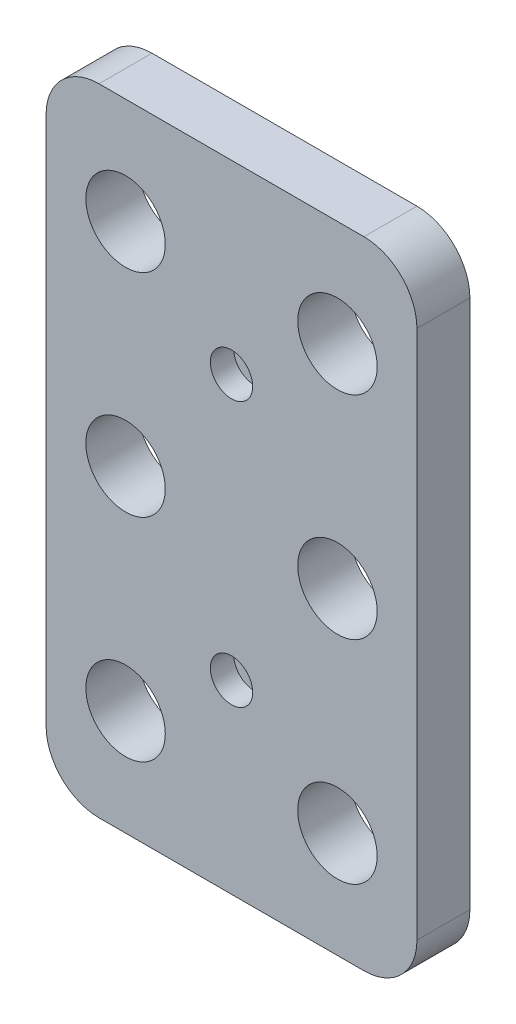
ISO-10303-21;
HEADER;
FILE_DESCRIPTION(('STEP AP214'),'2;1');
FILE_NAME('part.step','',(''),(''),'','','');
FILE_SCHEMA(('AUTOMOTIVE_DESIGN { 1 0 10303 214 1 1 1 1 }'));
ENDSEC;
DATA;
#1=APPLICATION_CONTEXT('core data for automotive mechanical design processes');
#2=APPLICATION_PROTOCOL_DEFINITION('international standard','automotive_design',2000,#1);
#3=PRODUCT_CONTEXT('',#1,'mechanical');
#4=PRODUCT('Part','Part','',(#3));
#5=PRODUCT_RELATED_PRODUCT_CATEGORY('part','',(#4));
#6=PRODUCT_DEFINITION_FORMATION('','',#4);
#7=PRODUCT_DEFINITION_CONTEXT('part definition',#1,'design');
#8=PRODUCT_DEFINITION('design','',#6,#7);
#9=PRODUCT_DEFINITION_SHAPE('','',#8);
#10=(LENGTH_UNIT() NAMED_UNIT(*) SI_UNIT(.MILLI.,.METRE.));
#11=(NAMED_UNIT(*) PLANE_ANGLE_UNIT() SI_UNIT($,.RADIAN.));
#12=(NAMED_UNIT(*) SI_UNIT($,.STERADIAN.) SOLID_ANGLE_UNIT());
#13=UNCERTAINTY_MEASURE_WITH_UNIT(LENGTH_MEASURE(1.E-05),#10,'distance_accuracy_value','');
#14=(GEOMETRIC_REPRESENTATION_CONTEXT(3) GLOBAL_UNCERTAINTY_ASSIGNED_CONTEXT((#13)) GLOBAL_UNIT_ASSIGNED_CONTEXT((#10,
#11,#12)) REPRESENTATION_CONTEXT('',''));
#15=CARTESIAN_POINT('',(0.,0.,0.));
#16=DIRECTION('',(0.,0.,1.));
#17=DIRECTION('',(1.,0.,0.));
#18=AXIS2_PLACEMENT_3D('',#15,#16,#17);
#19=CARTESIAN_POINT('',(0.,25.,10.));
#20=DIRECTION('',(0.,0.,-1.));
#21=DIRECTION('',(-1.,0.,0.));
#22=AXIS2_PLACEMENT_3D('',#19,#20,#21);
#23=CYLINDRICAL_SURFACE('',#22,2.25);
#24=CARTESIAN_POINT('',(0.,25.,0.));
#25=DIRECTION('',(0.,0.,1.));
#26=DIRECTION('',(1.,0.,0.));
#27=AXIS2_PLACEMENT_3D('',#24,#25,#26);
#28=CIRCLE('',#27,2.25);
#29=CARTESIAN_POINT('',(2.25,25.,0.));
#30=VERTEX_POINT('',#29);
#31=EDGE_CURVE('E214',#30,#30,#28,.T.);
#32=ORIENTED_EDGE('',*,*,#31,.F.);
#33=EDGE_LOOP('',(#32));
#34=FACE_BOUND('',#33,.T.);
#35=CARTESIAN_POINT('',(0.,25.,5.6));
#36=DIRECTION('',(0.,0.,1.));
#37=DIRECTION('',(1.,0.,0.));
#38=AXIS2_PLACEMENT_3D('',#35,#36,#37);
#39=CIRCLE('',#38,2.25);
#40=CARTESIAN_POINT('',(2.25,25.,5.6));
#41=VERTEX_POINT('',#40);
#42=EDGE_CURVE('E43',#41,#41,#39,.T.);
#43=ORIENTED_EDGE('',*,*,#42,.T.);
#44=EDGE_LOOP('',(#43));
#45=FACE_BOUND('',#44,.T.);
#46=ADVANCED_FACE('F39',(#34,#45),#23,.F.);
#47=CARTESIAN_POINT('',(0.,-25.,10.));
#48=DIRECTION('',(0.,0.,-1.));
#49=DIRECTION('',(-1.,0.,0.));
#50=AXIS2_PLACEMENT_3D('',#47,#48,#49);
#51=CYLINDRICAL_SURFACE('',#50,2.25);
#52=CARTESIAN_POINT('',(0.,-25.,0.));
#53=DIRECTION('',(0.,0.,1.));
#54=DIRECTION('',(-1.,0.,0.));
#55=AXIS2_PLACEMENT_3D('',#52,#53,#54);
#56=CIRCLE('',#55,2.25);
#57=CARTESIAN_POINT('',(-2.24999999999999,-25.,0.));
#58=VERTEX_POINT('',#57);
#59=EDGE_CURVE('E193',#58,#58,#56,.T.);
#60=ORIENTED_EDGE('',*,*,#59,.F.);
#61=EDGE_LOOP('',(#60));
#62=FACE_BOUND('',#61,.T.);
#63=CARTESIAN_POINT('',(0.,-25.,5.6));
#64=DIRECTION('',(0.,0.,1.));
#65=DIRECTION('',(1.,0.,0.));
#66=AXIS2_PLACEMENT_3D('',#63,#64,#65);
#67=CIRCLE('',#66,2.25);
#68=CARTESIAN_POINT('',(2.25,-25.,5.6));
#69=VERTEX_POINT('',#68);
#70=EDGE_CURVE('E184',#69,#69,#67,.T.);
#71=ORIENTED_EDGE('',*,*,#70,.T.);
#72=EDGE_LOOP('',(#71));
#73=FACE_BOUND('',#72,.T.);
#74=ADVANCED_FACE('F307',(#62,#73),#51,.F.);
#75=CARTESIAN_POINT('',(-25.,-50.,10.));
#76=DIRECTION('',(0.,0.,-1.));
#77=DIRECTION('',(-1.,0.,0.));
#78=AXIS2_PLACEMENT_3D('',#75,#76,#77);
#79=PLANE('',#78);
#80=CARTESIAN_POINT('',(0.,25.,10.));
#81=DIRECTION('',(0.,0.,1.));
#82=DIRECTION('',(1.,0.,0.));
#83=AXIS2_PLACEMENT_3D('',#80,#81,#82);
#84=CIRCLE('',#83,4.);
#85=CARTESIAN_POINT('',(4.,25.,10.));
#86=VERTEX_POINT('',#85);
#87=EDGE_CURVE('E195',#86,#86,#84,.T.);
#88=ORIENTED_EDGE('',*,*,#87,.F.);
#89=EDGE_LOOP('',(#88));
#90=FACE_BOUND('',#89,.T.);
#91=CARTESIAN_POINT('',(0.,-25.,10.));
#92=DIRECTION('',(0.,0.,1.));
#93=DIRECTION('',(1.,0.,0.));
#94=AXIS2_PLACEMENT_3D('',#91,#92,#93);
#95=CIRCLE('',#94,4.);
#96=CARTESIAN_POINT('',(4.,-25.,10.));
#97=VERTEX_POINT('',#96);
#98=EDGE_CURVE('E207',#97,#97,#95,.T.);
#99=ORIENTED_EDGE('',*,*,#98,.F.);
#100=EDGE_LOOP('',(#99));
#101=FACE_BOUND('',#100,.T.);
#102=CARTESIAN_POINT('',(-25.,-50.,10.));
#103=DIRECTION('',(0.,0.,1.));
#104=DIRECTION('',(-1.,0.,0.));
#105=AXIS2_PLACEMENT_3D('',#102,#103,#104);
#106=CIRCLE('',#105,10.);
#107=CARTESIAN_POINT('',(-35.,-49.9999999999999,10.));
#108=VERTEX_POINT('',#107);
#109=CARTESIAN_POINT('',(-24.9999999999999,-60.,10.));
#110=VERTEX_POINT('',#109);
#111=EDGE_CURVE('E167',#108,#110,#106,.T.);
#112=ORIENTED_EDGE('',*,*,#111,.T.);
#113=DIRECTION('',(1.,0.,0.));
#114=VECTOR('',#113,1.);
#115=CARTESIAN_POINT('',(-24.9999999999999,-60.,10.));
#116=LINE('',#115,#114);
#117=CARTESIAN_POINT('',(24.9999999999999,-60.,10.));
#118=VERTEX_POINT('',#117);
#119=EDGE_CURVE('E102',#110,#118,#116,.T.);
#120=ORIENTED_EDGE('',*,*,#119,.T.);
#121=CARTESIAN_POINT('',(25.,-50.,10.));
#122=DIRECTION('',(0.,0.,1.));
#123=DIRECTION('',(1.,0.,0.));
#124=AXIS2_PLACEMENT_3D('',#121,#122,#123);
#125=CIRCLE('',#124,10.);
#126=CARTESIAN_POINT('',(35.,-50.,10.));
#127=VERTEX_POINT('',#126);
#128=EDGE_CURVE('E269',#118,#127,#125,.T.);
#129=ORIENTED_EDGE('',*,*,#128,.T.);
#130=DIRECTION('',(0.,1.,0.));
#131=VECTOR('',#130,1.);
#132=CARTESIAN_POINT('',(35.,-49.9999999999999,10.));
#133=LINE('',#132,#131);
#134=CARTESIAN_POINT('',(35.,49.9999999999999,10.));
#135=VERTEX_POINT('',#134);
#136=EDGE_CURVE('E272',#127,#135,#133,.T.);
#137=ORIENTED_EDGE('',*,*,#136,.T.);
#138=CARTESIAN_POINT('',(25.,50.,10.));
#139=DIRECTION('',(0.,0.,1.));
#140=DIRECTION('',(-1.,0.,0.));
#141=AXIS2_PLACEMENT_3D('',#138,#139,#140);
#142=CIRCLE('',#141,10.);
#143=CARTESIAN_POINT('',(24.9999999999999,60.,10.));
#144=VERTEX_POINT('',#143);
#145=EDGE_CURVE('E122',#135,#144,#142,.T.);
#146=ORIENTED_EDGE('',*,*,#145,.T.);
#147=DIRECTION('',(-1.,0.,0.));
#148=VECTOR('',#147,1.);
#149=CARTESIAN_POINT('',(-24.9999999999999,60.,10.));
#150=LINE('',#149,#148);
#151=CARTESIAN_POINT('',(-24.9999999999999,60.,10.));
#152=VERTEX_POINT('',#151);
#153=EDGE_CURVE('E115',#144,#152,#150,.T.);
#154=ORIENTED_EDGE('',*,*,#153,.T.);
#155=CARTESIAN_POINT('',(-25.,50.,10.));
#156=DIRECTION('',(0.,0.,1.));
#157=DIRECTION('',(-1.,0.,0.));
#158=AXIS2_PLACEMENT_3D('',#155,#156,#157);
#159=CIRCLE('',#158,10.);
#160=CARTESIAN_POINT('',(-35.,49.9999999999999,10.));
#161=VERTEX_POINT('',#160);
#162=EDGE_CURVE('E120',#152,#161,#159,.T.);
#163=ORIENTED_EDGE('',*,*,#162,.T.);
#164=DIRECTION('',(0.,-1.,0.));
#165=VECTOR('',#164,1.);
#166=CARTESIAN_POINT('',(-35.,-49.9999999999999,10.));
#167=LINE('',#166,#165);
#168=EDGE_CURVE('E59',#161,#108,#167,.T.);
#169=ORIENTED_EDGE('',*,*,#168,.T.);
#170=EDGE_LOOP('',(#112,#120,#129,#137,#146,#154,#163,#169));
#171=FACE_BOUND('',#170,.T.);
#172=CARTESIAN_POINT('',(20.,40.,10.));
#173=DIRECTION('',(0.,0.,1.));
#174=DIRECTION('',(1.,0.,0.));
#175=AXIS2_PLACEMENT_3D('',#172,#173,#174);
#176=CIRCLE('',#175,7.5);
#177=CARTESIAN_POINT('',(27.5,40.,10.));
#178=VERTEX_POINT('',#177);
#179=EDGE_CURVE('E149',#178,#178,#176,.T.);
#180=ORIENTED_EDGE('',*,*,#179,.F.);
#181=EDGE_LOOP('',(#180));
#182=FACE_BOUND('',#181,.T.);
#183=CARTESIAN_POINT('',(20.,0.,10.));
#184=DIRECTION('',(0.,0.,1.));
#185=DIRECTION('',(1.,0.,0.));
#186=AXIS2_PLACEMENT_3D('',#183,#184,#185);
#187=CIRCLE('',#186,7.5);
#188=CARTESIAN_POINT('',(27.5,0.,10.));
#189=VERTEX_POINT('',#188);
#190=EDGE_CURVE('E251',#189,#189,#187,.T.);
#191=ORIENTED_EDGE('',*,*,#190,.F.);
#192=EDGE_LOOP('',(#191));
#193=FACE_BOUND('',#192,.T.);
#194=CARTESIAN_POINT('',(20.,-40.,10.));
#195=DIRECTION('',(0.,0.,1.));
#196=DIRECTION('',(-1.,0.,0.));
#197=AXIS2_PLACEMENT_3D('',#194,#195,#196);
#198=CIRCLE('',#197,7.5);
#199=CARTESIAN_POINT('',(12.5,-40.,10.));
#200=VERTEX_POINT('',#199);
#201=EDGE_CURVE('E243',#200,#200,#198,.T.);
#202=ORIENTED_EDGE('',*,*,#201,.F.);
#203=EDGE_LOOP('',(#202));
#204=FACE_BOUND('',#203,.T.);
#205=CARTESIAN_POINT('',(-20.,-40.,10.));
#206=DIRECTION('',(0.,0.,1.));
#207=DIRECTION('',(1.,0.,0.));
#208=AXIS2_PLACEMENT_3D('',#205,#206,#207);
#209=CIRCLE('',#208,7.5);
#210=CARTESIAN_POINT('',(-12.5,-40.,10.));
#211=VERTEX_POINT('',#210);
#212=EDGE_CURVE('E235',#211,#211,#209,.T.);
#213=ORIENTED_EDGE('',*,*,#212,.F.);
#214=EDGE_LOOP('',(#213));
#215=FACE_BOUND('',#214,.T.);
#216=CARTESIAN_POINT('',(-20.,0.,10.));
#217=DIRECTION('',(0.,0.,1.));
#218=DIRECTION('',(-1.,0.,0.));
#219=AXIS2_PLACEMENT_3D('',#216,#217,#218);
#220=CIRCLE('',#219,7.5);
#221=CARTESIAN_POINT('',(-27.5,0.,10.));
#222=VERTEX_POINT('',#221);
#223=EDGE_CURVE('E227',#222,#222,#220,.T.);
#224=ORIENTED_EDGE('',*,*,#223,.F.);
#225=EDGE_LOOP('',(#224));
#226=FACE_BOUND('',#225,.T.);
#227=CARTESIAN_POINT('',(-20.,40.,10.));
#228=DIRECTION('',(0.,0.,1.));
#229=DIRECTION('',(-1.,0.,0.));
#230=AXIS2_PLACEMENT_3D('',#227,#228,#229);
#231=CIRCLE('',#230,7.5);
#232=CARTESIAN_POINT('',(-27.5,40.,10.));
#233=VERTEX_POINT('',#232);
#234=EDGE_CURVE('E219',#233,#233,#231,.T.);
#235=ORIENTED_EDGE('',*,*,#234,.F.);
#236=EDGE_LOOP('',(#235));
#237=FACE_BOUND('',#236,.T.);
#238=ADVANCED_FACE('F117',(#90,#101,#171,#182,#193,#204,#215,#226,#237),#79,.F.);
#239=CARTESIAN_POINT('',(-25.,-50.,0.));
#240=DIRECTION('',(0.,0.,-1.));
#241=DIRECTION('',(-1.,0.,0.));
#242=AXIS2_PLACEMENT_3D('',#239,#240,#241);
#243=PLANE('',#242);
#244=ORIENTED_EDGE('',*,*,#31,.T.);
#245=EDGE_LOOP('',(#244));
#246=FACE_BOUND('',#245,.T.);
#247=CARTESIAN_POINT('',(-20.,0.,0.));
#248=DIRECTION('',(0.,0.,1.));
#249=DIRECTION('',(-1.,0.,0.));
#250=AXIS2_PLACEMENT_3D('',#247,#248,#249);
#251=CIRCLE('',#250,7.5);
#252=CARTESIAN_POINT('',(-27.5,0.,0.));
#253=VERTEX_POINT('',#252);
#254=EDGE_CURVE('E223',#253,#253,#251,.T.);
#255=ORIENTED_EDGE('',*,*,#254,.T.);
#256=EDGE_LOOP('',(#255));
#257=FACE_BOUND('',#256,.T.);
#258=CARTESIAN_POINT('',(20.,-40.,0.));
#259=DIRECTION('',(0.,0.,1.));
#260=DIRECTION('',(-1.,0.,0.));
#261=AXIS2_PLACEMENT_3D('',#258,#259,#260);
#262=CIRCLE('',#261,7.5);
#263=CARTESIAN_POINT('',(12.5,-40.,0.));
#264=VERTEX_POINT('',#263);
#265=EDGE_CURVE('E239',#264,#264,#262,.T.);
#266=ORIENTED_EDGE('',*,*,#265,.T.);
#267=EDGE_LOOP('',(#266));
#268=FACE_BOUND('',#267,.T.);
#269=CARTESIAN_POINT('',(20.,40.,0.));
#270=DIRECTION('',(0.,0.,1.));
#271=DIRECTION('',(1.,0.,0.));
#272=AXIS2_PLACEMENT_3D('',#269,#270,#271);
#273=CIRCLE('',#272,7.5);
#274=CARTESIAN_POINT('',(27.5,40.,0.));
#275=VERTEX_POINT('',#274);
#276=EDGE_CURVE('E255',#275,#275,#273,.T.);
#277=ORIENTED_EDGE('',*,*,#276,.T.);
#278=EDGE_LOOP('',(#277));
#279=FACE_BOUND('',#278,.T.);
#280=CARTESIAN_POINT('',(-25.,-50.,0.));
#281=DIRECTION('',(0.,0.,1.));
#282=DIRECTION('',(-1.,0.,0.));
#283=AXIS2_PLACEMENT_3D('',#280,#281,#282);
#284=CIRCLE('',#283,10.);
#285=CARTESIAN_POINT('',(-35.,-49.9999999999999,0.));
#286=VERTEX_POINT('',#285);
#287=CARTESIAN_POINT('',(-24.9999999999999,-60.,0.));
#288=VERTEX_POINT('',#287);
#289=EDGE_CURVE('E144',#286,#288,#284,.T.);
#290=ORIENTED_EDGE('',*,*,#289,.F.);
#291=DIRECTION('',(0.,-1.,0.));
#292=VECTOR('',#291,1.);
#293=CARTESIAN_POINT('',(-35.,-49.9999999999999,0.));
#294=LINE('',#293,#292);
#295=CARTESIAN_POINT('',(-35.,49.9999999999999,0.));
#296=VERTEX_POINT('',#295);
#297=EDGE_CURVE('E94',#296,#286,#294,.T.);
#298=ORIENTED_EDGE('',*,*,#297,.F.);
#299=CARTESIAN_POINT('',(-25.,50.,0.));
#300=DIRECTION('',(0.,0.,1.));
#301=DIRECTION('',(-1.,0.,0.));
#302=AXIS2_PLACEMENT_3D('',#299,#300,#301);
#303=CIRCLE('',#302,10.);
#304=CARTESIAN_POINT('',(-24.9999999999999,60.,0.));
#305=VERTEX_POINT('',#304);
#306=EDGE_CURVE('E88',#305,#296,#303,.T.);
#307=ORIENTED_EDGE('',*,*,#306,.F.);
#308=DIRECTION('',(-1.,0.,0.));
#309=VECTOR('',#308,1.);
#310=CARTESIAN_POINT('',(-24.9999999999999,60.,0.));
#311=LINE('',#310,#309);
#312=CARTESIAN_POINT('',(24.9999999999999,60.,0.));
#313=VERTEX_POINT('',#312);
#314=EDGE_CURVE('E131',#313,#305,#311,.T.);
#315=ORIENTED_EDGE('',*,*,#314,.F.);
#316=CARTESIAN_POINT('',(25.,50.,0.));
#317=DIRECTION('',(0.,0.,1.));
#318=DIRECTION('',(-1.,0.,0.));
#319=AXIS2_PLACEMENT_3D('',#316,#317,#318);
#320=CIRCLE('',#319,10.);
#321=CARTESIAN_POINT('',(35.,49.9999999999999,0.));
#322=VERTEX_POINT('',#321);
#323=EDGE_CURVE('E158',#322,#313,#320,.T.);
#324=ORIENTED_EDGE('',*,*,#323,.F.);
#325=DIRECTION('',(0.,1.,0.));
#326=VECTOR('',#325,1.);
#327=CARTESIAN_POINT('',(35.,-49.9999999999999,0.));
#328=LINE('',#327,#326);
#329=CARTESIAN_POINT('',(35.,-50.,0.));
#330=VERTEX_POINT('',#329);
#331=EDGE_CURVE('E155',#330,#322,#328,.T.);
#332=ORIENTED_EDGE('',*,*,#331,.F.);
#333=CARTESIAN_POINT('',(25.,-50.,0.));
#334=DIRECTION('',(0.,0.,1.));
#335=DIRECTION('',(1.,0.,0.));
#336=AXIS2_PLACEMENT_3D('',#333,#334,#335);
#337=CIRCLE('',#336,10.);
#338=CARTESIAN_POINT('',(24.9999999999999,-60.,0.));
#339=VERTEX_POINT('',#338);
#340=EDGE_CURVE('E152',#339,#330,#337,.T.);
#341=ORIENTED_EDGE('',*,*,#340,.F.);
#342=DIRECTION('',(1.,0.,0.));
#343=VECTOR('',#342,1.);
#344=CARTESIAN_POINT('',(-24.9999999999999,-60.,0.));
#345=LINE('',#344,#343);
#346=EDGE_CURVE('E148',#288,#339,#345,.T.);
#347=ORIENTED_EDGE('',*,*,#346,.F.);
#348=EDGE_LOOP('',(#290,#298,#307,#315,#324,#332,#341,#347));
#349=FACE_BOUND('',#348,.T.);
#350=CARTESIAN_POINT('',(20.,0.,0.));
#351=DIRECTION('',(0.,0.,1.));
#352=DIRECTION('',(1.,0.,0.));
#353=AXIS2_PLACEMENT_3D('',#350,#351,#352);
#354=CIRCLE('',#353,7.5);
#355=CARTESIAN_POINT('',(27.5,0.,0.));
#356=VERTEX_POINT('',#355);
#357=EDGE_CURVE('E247',#356,#356,#354,.T.);
#358=ORIENTED_EDGE('',*,*,#357,.T.);
#359=EDGE_LOOP('',(#358));
#360=FACE_BOUND('',#359,.T.);
#361=CARTESIAN_POINT('',(-20.,-40.,0.));
#362=DIRECTION('',(0.,0.,1.));
#363=DIRECTION('',(1.,0.,0.));
#364=AXIS2_PLACEMENT_3D('',#361,#362,#363);
#365=CIRCLE('',#364,7.5);
#366=CARTESIAN_POINT('',(-12.5,-40.,0.));
#367=VERTEX_POINT('',#366);
#368=EDGE_CURVE('E231',#367,#367,#365,.T.);
#369=ORIENTED_EDGE('',*,*,#368,.T.);
#370=EDGE_LOOP('',(#369));
#371=FACE_BOUND('',#370,.T.);
#372=CARTESIAN_POINT('',(-20.,40.,0.));
#373=DIRECTION('',(0.,0.,1.));
#374=DIRECTION('',(-1.,0.,0.));
#375=AXIS2_PLACEMENT_3D('',#372,#373,#374);
#376=CIRCLE('',#375,7.5);
#377=CARTESIAN_POINT('',(-27.5,40.,0.));
#378=VERTEX_POINT('',#377);
#379=EDGE_CURVE('E218',#378,#378,#376,.T.);
#380=ORIENTED_EDGE('',*,*,#379,.T.);
#381=EDGE_LOOP('',(#380));
#382=FACE_BOUND('',#381,.T.);
#383=ORIENTED_EDGE('',*,*,#59,.T.);
#384=EDGE_LOOP('',(#383));
#385=FACE_BOUND('',#384,.T.);
#386=ADVANCED_FACE('F287',(#246,#257,#268,#279,#349,#360,#371,#382,#385),#243,.T.);
#387=CARTESIAN_POINT('',(-25.,-50.,10.));
#388=DIRECTION('',(0.,0.,-1.));
#389=DIRECTION('',(-1.,0.,0.));
#390=AXIS2_PLACEMENT_3D('',#387,#388,#389);
#391=CYLINDRICAL_SURFACE('',#390,10.);
#392=ORIENTED_EDGE('',*,*,#289,.T.);
#393=DIRECTION('',(0.,0.,-1.));
#394=VECTOR('',#393,1.);
#395=CARTESIAN_POINT('',(-24.9999999999999,-60.,10.));
#396=LINE('',#395,#394);
#397=EDGE_CURVE('E11',#110,#288,#396,.T.);
#398=ORIENTED_EDGE('',*,*,#397,.F.);
#399=ORIENTED_EDGE('',*,*,#111,.F.);
#400=DIRECTION('',(0.,0.,-1.));
#401=VECTOR('',#400,1.);
#402=CARTESIAN_POINT('',(-35.,-49.9999999999999,10.));
#403=LINE('',#402,#401);
#404=EDGE_CURVE('E140',#108,#286,#403,.T.);
#405=ORIENTED_EDGE('',*,*,#404,.T.);
#406=EDGE_LOOP('',(#392,#398,#399,#405));
#407=FACE_BOUND('',#406,.T.);
#408=ADVANCED_FACE('F41',(#407),#391,.T.);
#409=CARTESIAN_POINT('',(-24.9999999999999,-60.,10.));
#410=DIRECTION('',(0.,1.,0.));
#411=DIRECTION('',(0.,0.,1.));
#412=AXIS2_PLACEMENT_3D('',#409,#410,#411);
#413=PLANE('',#412);
#414=ORIENTED_EDGE('',*,*,#346,.T.);
#415=DIRECTION('',(0.,0.,-1.));
#416=VECTOR('',#415,1.);
#417=CARTESIAN_POINT('',(24.9999999999999,-60.,10.));
#418=LINE('',#417,#416);
#419=EDGE_CURVE('E50',#118,#339,#418,.T.);
#420=ORIENTED_EDGE('',*,*,#419,.F.);
#421=ORIENTED_EDGE('',*,*,#119,.F.);
#422=ORIENTED_EDGE('',*,*,#397,.T.);
#423=EDGE_LOOP('',(#414,#420,#421,#422));
#424=FACE_BOUND('',#423,.T.);
#425=ADVANCED_FACE('F346',(#424),#413,.F.);
#426=CARTESIAN_POINT('',(25.,-50.,10.));
#427=DIRECTION('',(0.,0.,-1.));
#428=DIRECTION('',(-1.,0.,0.));
#429=AXIS2_PLACEMENT_3D('',#426,#427,#428);
#430=CYLINDRICAL_SURFACE('',#429,10.);
#431=ORIENTED_EDGE('',*,*,#340,.T.);
#432=DIRECTION('',(0.,0.,-1.));
#433=VECTOR('',#432,1.);
#434=CARTESIAN_POINT('',(35.,-50.,10.));
#435=LINE('',#434,#433);
#436=EDGE_CURVE('E178',#127,#330,#435,.T.);
#437=ORIENTED_EDGE('',*,*,#436,.F.);
#438=ORIENTED_EDGE('',*,*,#128,.F.);
#439=ORIENTED_EDGE('',*,*,#419,.T.);
#440=EDGE_LOOP('',(#431,#437,#438,#439));
#441=FACE_BOUND('',#440,.T.);
#442=ADVANCED_FACE('F359',(#441),#430,.T.);
#443=CARTESIAN_POINT('',(35.,-49.9999999999999,10.));
#444=DIRECTION('',(-1.,0.,0.));
#445=DIRECTION('',(0.,0.,1.));
#446=AXIS2_PLACEMENT_3D('',#443,#444,#445);
#447=PLANE('',#446);
#448=ORIENTED_EDGE('',*,*,#331,.T.);
#449=DIRECTION('',(0.,0.,-1.));
#450=VECTOR('',#449,1.);
#451=CARTESIAN_POINT('',(35.,49.9999999999999,10.));
#452=LINE('',#451,#450);
#453=EDGE_CURVE('E174',#135,#322,#452,.T.);
#454=ORIENTED_EDGE('',*,*,#453,.F.);
#455=ORIENTED_EDGE('',*,*,#136,.F.);
#456=ORIENTED_EDGE('',*,*,#436,.T.);
#457=EDGE_LOOP('',(#448,#454,#455,#456));
#458=FACE_BOUND('',#457,.T.);
#459=ADVANCED_FACE('F280',(#458),#447,.F.);
#460=CARTESIAN_POINT('',(25.,50.,10.));
#461=DIRECTION('',(0.,0.,-1.));
#462=DIRECTION('',(-1.,0.,0.));
#463=AXIS2_PLACEMENT_3D('',#460,#461,#462);
#464=CYLINDRICAL_SURFACE('',#463,10.);
#465=ORIENTED_EDGE('',*,*,#323,.T.);
#466=DIRECTION('',(0.,0.,-1.));
#467=VECTOR('',#466,1.);
#468=CARTESIAN_POINT('',(24.9999999999999,60.,10.));
#469=LINE('',#468,#467);
#470=EDGE_CURVE('E133',#144,#313,#469,.T.);
#471=ORIENTED_EDGE('',*,*,#470,.F.);
#472=ORIENTED_EDGE('',*,*,#145,.F.);
#473=ORIENTED_EDGE('',*,*,#453,.T.);
#474=EDGE_LOOP('',(#465,#471,#472,#473));
#475=FACE_BOUND('',#474,.T.);
#476=ADVANCED_FACE('F284',(#475),#464,.T.);
#477=CARTESIAN_POINT('',(-24.9999999999999,60.,10.));
#478=DIRECTION('',(0.,-1.,0.));
#479=DIRECTION('',(0.,0.,-1.));
#480=AXIS2_PLACEMENT_3D('',#477,#478,#479);
#481=PLANE('',#480);
#482=ORIENTED_EDGE('',*,*,#314,.T.);
#483=DIRECTION('',(0.,0.,-1.));
#484=VECTOR('',#483,1.);
#485=CARTESIAN_POINT('',(-24.9999999999999,60.,10.));
#486=LINE('',#485,#484);
#487=EDGE_CURVE('E128',#152,#305,#486,.T.);
#488=ORIENTED_EDGE('',*,*,#487,.F.);
#489=ORIENTED_EDGE('',*,*,#153,.F.);
#490=ORIENTED_EDGE('',*,*,#470,.T.);
#491=EDGE_LOOP('',(#482,#488,#489,#490));
#492=FACE_BOUND('',#491,.T.);
#493=ADVANCED_FACE('F129',(#492),#481,.F.);
#494=CARTESIAN_POINT('',(-25.,50.,10.));
#495=DIRECTION('',(0.,0.,-1.));
#496=DIRECTION('',(-1.,0.,0.));
#497=AXIS2_PLACEMENT_3D('',#494,#495,#496);
#498=CYLINDRICAL_SURFACE('',#497,10.);
#499=ORIENTED_EDGE('',*,*,#306,.T.);
#500=DIRECTION('',(0.,0.,-1.));
#501=VECTOR('',#500,1.);
#502=CARTESIAN_POINT('',(-35.,49.9999999999999,10.));
#503=LINE('',#502,#501);
#504=EDGE_CURVE('E134',#161,#296,#503,.T.);
#505=ORIENTED_EDGE('',*,*,#504,.F.);
#506=ORIENTED_EDGE('',*,*,#162,.F.);
#507=ORIENTED_EDGE('',*,*,#487,.T.);
#508=EDGE_LOOP('',(#499,#505,#506,#507));
#509=FACE_BOUND('',#508,.T.);
#510=ADVANCED_FACE('F136',(#509),#498,.T.);
#511=CARTESIAN_POINT('',(-35.,-49.9999999999999,10.));
#512=DIRECTION('',(1.,0.,0.));
#513=DIRECTION('',(0.,0.,-1.));
#514=AXIS2_PLACEMENT_3D('',#511,#512,#513);
#515=PLANE('',#514);
#516=ORIENTED_EDGE('',*,*,#297,.T.);
#517=ORIENTED_EDGE('',*,*,#404,.F.);
#518=ORIENTED_EDGE('',*,*,#168,.F.);
#519=ORIENTED_EDGE('',*,*,#504,.T.);
#520=EDGE_LOOP('',(#516,#517,#518,#519));
#521=FACE_BOUND('',#520,.T.);
#522=ADVANCED_FACE('F293',(#521),#515,.F.);
#523=CARTESIAN_POINT('',(20.,40.,10.));
#524=DIRECTION('',(0.,0.,-1.));
#525=DIRECTION('',(-1.,0.,0.));
#526=AXIS2_PLACEMENT_3D('',#523,#524,#525);
#527=CYLINDRICAL_SURFACE('',#526,7.5);
#528=ORIENTED_EDGE('',*,*,#179,.T.);
#529=EDGE_LOOP('',(#528));
#530=FACE_BOUND('',#529,.T.);
#531=ORIENTED_EDGE('',*,*,#276,.F.);
#532=EDGE_LOOP('',(#531));
#533=FACE_BOUND('',#532,.T.);
#534=ADVANCED_FACE('F295',(#530,#533),#527,.F.);
#535=CARTESIAN_POINT('',(20.,0.,10.));
#536=DIRECTION('',(0.,0.,-1.));
#537=DIRECTION('',(-1.,0.,0.));
#538=AXIS2_PLACEMENT_3D('',#535,#536,#537);
#539=CYLINDRICAL_SURFACE('',#538,7.5);
#540=ORIENTED_EDGE('',*,*,#190,.T.);
#541=EDGE_LOOP('',(#540));
#542=FACE_BOUND('',#541,.T.);
#543=ORIENTED_EDGE('',*,*,#357,.F.);
#544=EDGE_LOOP('',(#543));
#545=FACE_BOUND('',#544,.T.);
#546=ADVANCED_FACE('F301',(#542,#545),#539,.F.);
#547=CARTESIAN_POINT('',(20.,-40.,10.));
#548=DIRECTION('',(0.,0.,-1.));
#549=DIRECTION('',(-1.,0.,0.));
#550=AXIS2_PLACEMENT_3D('',#547,#548,#549);
#551=CYLINDRICAL_SURFACE('',#550,7.5);
#552=ORIENTED_EDGE('',*,*,#201,.T.);
#553=EDGE_LOOP('',(#552));
#554=FACE_BOUND('',#553,.T.);
#555=ORIENTED_EDGE('',*,*,#265,.F.);
#556=EDGE_LOOP('',(#555));
#557=FACE_BOUND('',#556,.T.);
#558=ADVANCED_FACE('F331',(#554,#557),#551,.F.);
#559=CARTESIAN_POINT('',(-20.,-40.,10.));
#560=DIRECTION('',(0.,0.,-1.));
#561=DIRECTION('',(-1.,0.,0.));
#562=AXIS2_PLACEMENT_3D('',#559,#560,#561);
#563=CYLINDRICAL_SURFACE('',#562,7.5);
#564=ORIENTED_EDGE('',*,*,#212,.T.);
#565=EDGE_LOOP('',(#564));
#566=FACE_BOUND('',#565,.T.);
#567=ORIENTED_EDGE('',*,*,#368,.F.);
#568=EDGE_LOOP('',(#567));
#569=FACE_BOUND('',#568,.T.);
#570=ADVANCED_FACE('F327',(#566,#569),#563,.F.);
#571=CARTESIAN_POINT('',(-20.,0.,10.));
#572=DIRECTION('',(0.,0.,-1.));
#573=DIRECTION('',(-1.,0.,0.));
#574=AXIS2_PLACEMENT_3D('',#571,#572,#573);
#575=CYLINDRICAL_SURFACE('',#574,7.5);
#576=ORIENTED_EDGE('',*,*,#223,.T.);
#577=EDGE_LOOP('',(#576));
#578=FACE_BOUND('',#577,.T.);
#579=ORIENTED_EDGE('',*,*,#254,.F.);
#580=EDGE_LOOP('',(#579));
#581=FACE_BOUND('',#580,.T.);
#582=ADVANCED_FACE('F323',(#578,#581),#575,.F.);
#583=CARTESIAN_POINT('',(-20.,40.,10.));
#584=DIRECTION('',(0.,0.,-1.));
#585=DIRECTION('',(-1.,0.,0.));
#586=AXIS2_PLACEMENT_3D('',#583,#584,#585);
#587=CYLINDRICAL_SURFACE('',#586,7.5);
#588=ORIENTED_EDGE('',*,*,#234,.T.);
#589=EDGE_LOOP('',(#588));
#590=FACE_BOUND('',#589,.T.);
#591=ORIENTED_EDGE('',*,*,#379,.F.);
#592=EDGE_LOOP('',(#591));
#593=FACE_BOUND('',#592,.T.);
#594=ADVANCED_FACE('F319',(#590,#593),#587,.F.);
#595=CARTESIAN_POINT('',(0.,-25.,5.6));
#596=DIRECTION('',(0.,0.,1.));
#597=DIRECTION('',(1.,0.,0.));
#598=AXIS2_PLACEMENT_3D('',#595,#596,#597);
#599=CYLINDRICAL_SURFACE('',#598,4.);
#600=CARTESIAN_POINT('',(0.,-25.,5.6));
#601=DIRECTION('',(0.,0.,1.));
#602=DIRECTION('',(1.,0.,0.));
#603=AXIS2_PLACEMENT_3D('',#600,#601,#602);
#604=CIRCLE('',#603,4.);
#605=CARTESIAN_POINT('',(4.,-25.,5.6));
#606=VERTEX_POINT('',#605);
#607=EDGE_CURVE('E201',#606,#606,#604,.T.);
#608=ORIENTED_EDGE('',*,*,#607,.F.);
#609=EDGE_LOOP('',(#608));
#610=FACE_BOUND('',#609,.T.);
#611=ORIENTED_EDGE('',*,*,#98,.T.);
#612=EDGE_LOOP('',(#611));
#613=FACE_BOUND('',#612,.T.);
#614=ADVANCED_FACE('F322',(#610,#613),#599,.F.);
#615=CARTESIAN_POINT('',(0.,-25.,5.6));
#616=DIRECTION('',(0.,0.,1.));
#617=DIRECTION('',(1.,0.,0.));
#618=AXIS2_PLACEMENT_3D('',#615,#616,#617);
#619=PLANE('',#618);
#620=ORIENTED_EDGE('',*,*,#70,.F.);
#621=EDGE_LOOP('',(#620));
#622=FACE_BOUND('',#621,.T.);
#623=ORIENTED_EDGE('',*,*,#607,.T.);
#624=EDGE_LOOP('',(#623));
#625=FACE_BOUND('',#624,.T.);
#626=ADVANCED_FACE('F445',(#622,#625),#619,.T.);
#627=CARTESIAN_POINT('',(0.,25.,5.6));
#628=DIRECTION('',(0.,0.,1.));
#629=DIRECTION('',(1.,0.,0.));
#630=AXIS2_PLACEMENT_3D('',#627,#628,#629);
#631=CYLINDRICAL_SURFACE('',#630,4.);
#632=CARTESIAN_POINT('',(0.,25.,5.6));
#633=DIRECTION('',(0.,0.,1.));
#634=DIRECTION('',(1.,0.,0.));
#635=AXIS2_PLACEMENT_3D('',#632,#633,#634);
#636=CIRCLE('',#635,4.);
#637=CARTESIAN_POINT('',(4.,25.,5.6));
#638=VERTEX_POINT('',#637);
#639=EDGE_CURVE('E187',#638,#638,#636,.T.);
#640=ORIENTED_EDGE('',*,*,#639,.F.);
#641=EDGE_LOOP('',(#640));
#642=FACE_BOUND('',#641,.T.);
#643=ORIENTED_EDGE('',*,*,#87,.T.);
#644=EDGE_LOOP('',(#643));
#645=FACE_BOUND('',#644,.T.);
#646=ADVANCED_FACE('F454',(#642,#645),#631,.F.);
#647=CARTESIAN_POINT('',(0.,25.,5.6));
#648=DIRECTION('',(0.,0.,1.));
#649=DIRECTION('',(1.,0.,0.));
#650=AXIS2_PLACEMENT_3D('',#647,#648,#649);
#651=PLANE('',#650);
#652=ORIENTED_EDGE('',*,*,#42,.F.);
#653=EDGE_LOOP('',(#652));
#654=FACE_BOUND('',#653,.T.);
#655=ORIENTED_EDGE('',*,*,#639,.T.);
#656=EDGE_LOOP('',(#655));
#657=FACE_BOUND('',#656,.T.);
#658=ADVANCED_FACE('F464',(#654,#657),#651,.T.);
#659=CLOSED_SHELL('',(#46,#74,#238,#386,#408,#425,#442,#459,#476,#493,#510,#522,#534,#546,#558,
#570,#582,#594,#614,#626,#646,#658));
#660=MANIFOLD_SOLID_BREP('B2',#659);
#661=ADVANCED_BREP_SHAPE_REPRESENTATION('',(#18,#660),#14);
#662=SHAPE_DEFINITION_REPRESENTATION(#9,#661);
ENDSEC;
END-ISO-10303-21;
